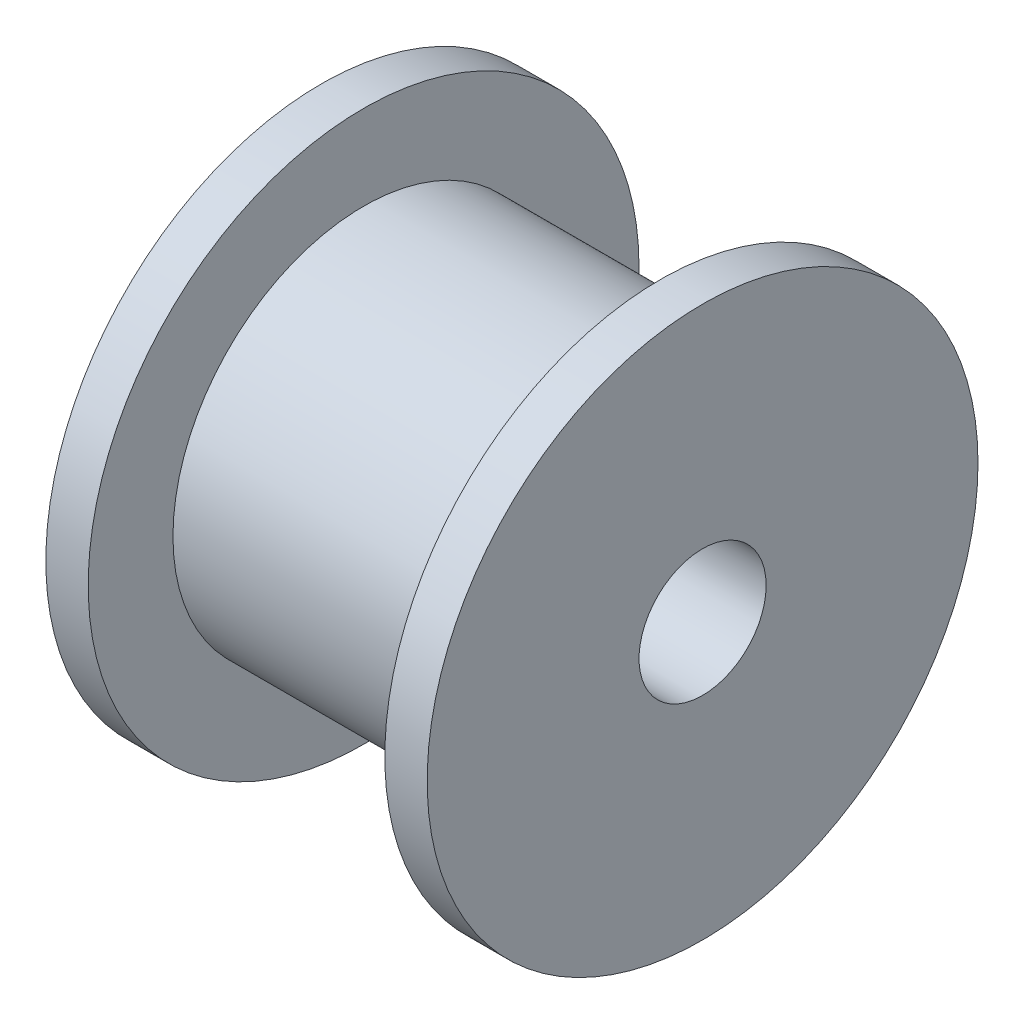
ISO-10303-21;
HEADER;
FILE_DESCRIPTION(('STEP AP214'),'2;1');
FILE_NAME('part.step','',(''),(''),'','','');
FILE_SCHEMA(('AUTOMOTIVE_DESIGN { 1 0 10303 214 1 1 1 1 }'));
ENDSEC;
DATA;
#1=APPLICATION_CONTEXT('core data for automotive mechanical design processes');
#2=APPLICATION_PROTOCOL_DEFINITION('international standard','automotive_design',2000,#1);
#3=PRODUCT_CONTEXT('',#1,'mechanical');
#4=PRODUCT('Part','Part','',(#3));
#5=PRODUCT_RELATED_PRODUCT_CATEGORY('part','',(#4));
#6=PRODUCT_DEFINITION_FORMATION('','',#4);
#7=PRODUCT_DEFINITION_CONTEXT('part definition',#1,'design');
#8=PRODUCT_DEFINITION('design','',#6,#7);
#9=PRODUCT_DEFINITION_SHAPE('','',#8);
#10=(LENGTH_UNIT() NAMED_UNIT(*) SI_UNIT(.MILLI.,.METRE.));
#11=(NAMED_UNIT(*) PLANE_ANGLE_UNIT() SI_UNIT($,.RADIAN.));
#12=(NAMED_UNIT(*) SI_UNIT($,.STERADIAN.) SOLID_ANGLE_UNIT());
#13=UNCERTAINTY_MEASURE_WITH_UNIT(LENGTH_MEASURE(1.E-05),#10,'distance_accuracy_value','');
#14=(GEOMETRIC_REPRESENTATION_CONTEXT(3) GLOBAL_UNCERTAINTY_ASSIGNED_CONTEXT((#13)) GLOBAL_UNIT_ASSIGNED_CONTEXT((#10,
#11,#12)) REPRESENTATION_CONTEXT('',''));
#15=CARTESIAN_POINT('',(0.,0.,0.));
#16=DIRECTION('',(0.,0.,1.));
#17=DIRECTION('',(1.,0.,0.));
#18=AXIS2_PLACEMENT_3D('',#15,#16,#17);
#19=CARTESIAN_POINT('',(-4.5,0.,0.));
#20=DIRECTION('',(1.,0.,0.));
#21=DIRECTION('',(0.,0.,-1.));
#22=AXIS2_PLACEMENT_3D('',#19,#20,#21);
#23=CYLINDRICAL_SURFACE('',#22,6.5);
#24=CARTESIAN_POINT('',(-4.5,0.,0.));
#25=DIRECTION('',(1.,0.,0.));
#26=DIRECTION('',(0.,0.,-1.));
#27=AXIS2_PLACEMENT_3D('',#24,#25,#26);
#28=CIRCLE('',#27,6.5);
#29=CARTESIAN_POINT('',(-4.5,0.,-6.5));
#30=VERTEX_POINT('',#29);
#31=EDGE_CURVE('E10',#30,#30,#28,.T.);
#32=ORIENTED_EDGE('',*,*,#31,.T.);
#33=EDGE_LOOP('',(#32));
#34=FACE_BOUND('',#33,.T.);
#35=CARTESIAN_POINT('',(-3.5,0.,0.));
#36=DIRECTION('',(1.,0.,0.));
#37=DIRECTION('',(0.,0.,-1.));
#38=AXIS2_PLACEMENT_3D('',#35,#36,#37);
#39=CIRCLE('',#38,6.5);
#40=CARTESIAN_POINT('',(-3.5,0.,-6.5));
#41=VERTEX_POINT('',#40);
#42=EDGE_CURVE('E60',#41,#41,#39,.T.);
#43=ORIENTED_EDGE('',*,*,#42,.F.);
#44=EDGE_LOOP('',(#43));
#45=FACE_BOUND('',#44,.T.);
#46=ADVANCED_FACE('F34',(#34,#45),#23,.T.);
#47=CARTESIAN_POINT('',(-4.5,0.,0.));
#48=DIRECTION('',(1.,0.,0.));
#49=DIRECTION('',(0.,0.,-1.));
#50=AXIS2_PLACEMENT_3D('',#47,#48,#49);
#51=CYLINDRICAL_SURFACE('',#50,1.5);
#52=CARTESIAN_POINT('',(-4.5,0.,0.));
#53=DIRECTION('',(1.,0.,0.));
#54=DIRECTION('',(0.,0.,-1.));
#55=AXIS2_PLACEMENT_3D('',#52,#53,#54);
#56=CIRCLE('',#55,1.5);
#57=CARTESIAN_POINT('',(-4.5,0.,-1.5));
#58=VERTEX_POINT('',#57);
#59=EDGE_CURVE('E41',#58,#58,#56,.T.);
#60=ORIENTED_EDGE('',*,*,#59,.F.);
#61=EDGE_LOOP('',(#60));
#62=FACE_BOUND('',#61,.T.);
#63=CARTESIAN_POINT('',(4.5,0.,0.));
#64=DIRECTION('',(1.,0.,0.));
#65=DIRECTION('',(0.,0.,-1.));
#66=AXIS2_PLACEMENT_3D('',#63,#64,#65);
#67=CIRCLE('',#66,1.5);
#68=CARTESIAN_POINT('',(4.5,0.,-1.5));
#69=VERTEX_POINT('',#68);
#70=EDGE_CURVE('E49',#69,#69,#67,.T.);
#71=ORIENTED_EDGE('',*,*,#70,.T.);
#72=EDGE_LOOP('',(#71));
#73=FACE_BOUND('',#72,.T.);
#74=ADVANCED_FACE('F36',(#62,#73),#51,.F.);
#75=CARTESIAN_POINT('',(3.5,0.,0.));
#76=DIRECTION('',(1.,0.,0.));
#77=DIRECTION('',(0.,0.,-1.));
#78=AXIS2_PLACEMENT_3D('',#75,#76,#77);
#79=CIRCLE('',#78,6.5);
#80=CARTESIAN_POINT('',(3.5,0.,-6.5));
#81=VERTEX_POINT('',#80);
#82=EDGE_CURVE('E54',#81,#81,#79,.T.);
#83=ORIENTED_EDGE('',*,*,#82,.T.);
#84=EDGE_LOOP('',(#83));
#85=FACE_BOUND('',#84,.T.);
#86=CARTESIAN_POINT('',(4.5,0.,0.));
#87=DIRECTION('',(1.,0.,0.));
#88=DIRECTION('',(0.,0.,-1.));
#89=AXIS2_PLACEMENT_3D('',#86,#87,#88);
#90=CIRCLE('',#89,6.5);
#91=CARTESIAN_POINT('',(4.5,0.,-6.5));
#92=VERTEX_POINT('',#91);
#93=EDGE_CURVE('E45',#92,#92,#90,.T.);
#94=ORIENTED_EDGE('',*,*,#93,.F.);
#95=EDGE_LOOP('',(#94));
#96=FACE_BOUND('',#95,.T.);
#97=ADVANCED_FACE('F77',(#85,#96),#23,.T.);
#98=CARTESIAN_POINT('',(-4.5,0.,0.));
#99=DIRECTION('',(1.,0.,0.));
#100=DIRECTION('',(0.,0.,-1.));
#101=AXIS2_PLACEMENT_3D('',#98,#99,#100);
#102=PLANE('',#101);
#103=ORIENTED_EDGE('',*,*,#59,.T.);
#104=EDGE_LOOP('',(#103));
#105=FACE_BOUND('',#104,.T.);
#106=ORIENTED_EDGE('',*,*,#31,.F.);
#107=EDGE_LOOP('',(#106));
#108=FACE_BOUND('',#107,.T.);
#109=ADVANCED_FACE('F84',(#105,#108),#102,.F.);
#110=CARTESIAN_POINT('',(4.5,0.,0.));
#111=DIRECTION('',(1.,0.,0.));
#112=DIRECTION('',(0.,0.,-1.));
#113=AXIS2_PLACEMENT_3D('',#110,#111,#112);
#114=PLANE('',#113);
#115=ORIENTED_EDGE('',*,*,#70,.F.);
#116=EDGE_LOOP('',(#115));
#117=FACE_BOUND('',#116,.T.);
#118=ORIENTED_EDGE('',*,*,#93,.T.);
#119=EDGE_LOOP('',(#118));
#120=FACE_BOUND('',#119,.T.);
#121=ADVANCED_FACE('F89',(#117,#120),#114,.T.);
#122=CARTESIAN_POINT('',(3.5,0.,0.));
#123=DIRECTION('',(-1.,0.,0.));
#124=DIRECTION('',(0.,0.,1.));
#125=AXIS2_PLACEMENT_3D('',#122,#123,#124);
#126=CYLINDRICAL_SURFACE('',#125,4.5);
#127=CARTESIAN_POINT('',(3.5,0.,0.));
#128=DIRECTION('',(1.,0.,0.));
#129=DIRECTION('',(0.,0.,-1.));
#130=AXIS2_PLACEMENT_3D('',#127,#128,#129);
#131=CIRCLE('',#130,4.5);
#132=CARTESIAN_POINT('',(3.5,0.,-4.5));
#133=VERTEX_POINT('',#132);
#134=EDGE_CURVE('E57',#133,#133,#131,.T.);
#135=ORIENTED_EDGE('',*,*,#134,.F.);
#136=EDGE_LOOP('',(#135));
#137=FACE_BOUND('',#136,.T.);
#138=CARTESIAN_POINT('',(-3.5,0.,0.));
#139=DIRECTION('',(1.,0.,0.));
#140=DIRECTION('',(0.,0.,-1.));
#141=AXIS2_PLACEMENT_3D('',#138,#139,#140);
#142=CIRCLE('',#141,4.5);
#143=CARTESIAN_POINT('',(-3.5,0.,-4.5));
#144=VERTEX_POINT('',#143);
#145=EDGE_CURVE('E63',#144,#144,#142,.T.);
#146=ORIENTED_EDGE('',*,*,#145,.T.);
#147=EDGE_LOOP('',(#146));
#148=FACE_BOUND('',#147,.T.);
#149=ADVANCED_FACE('F67',(#137,#148),#126,.T.);
#150=CARTESIAN_POINT('',(3.5,0.,0.));
#151=DIRECTION('',(1.,0.,0.));
#152=DIRECTION('',(0.,0.,-1.));
#153=AXIS2_PLACEMENT_3D('',#150,#151,#152);
#154=PLANE('',#153);
#155=ORIENTED_EDGE('',*,*,#134,.T.);
#156=EDGE_LOOP('',(#155));
#157=FACE_BOUND('',#156,.T.);
#158=ORIENTED_EDGE('',*,*,#82,.F.);
#159=EDGE_LOOP('',(#158));
#160=FACE_BOUND('',#159,.T.);
#161=ADVANCED_FACE('F72',(#157,#160),#154,.F.);
#162=CARTESIAN_POINT('',(-3.5,0.,0.));
#163=DIRECTION('',(1.,0.,0.));
#164=DIRECTION('',(0.,0.,-1.));
#165=AXIS2_PLACEMENT_3D('',#162,#163,#164);
#166=PLANE('',#165);
#167=ORIENTED_EDGE('',*,*,#145,.F.);
#168=EDGE_LOOP('',(#167));
#169=FACE_BOUND('',#168,.T.);
#170=ORIENTED_EDGE('',*,*,#42,.T.);
#171=EDGE_LOOP('',(#170));
#172=FACE_BOUND('',#171,.T.);
#173=ADVANCED_FACE('F69',(#169,#172),#166,.T.);
#174=CLOSED_SHELL('',(#46,#74,#97,#109,#121,#149,#161,#173));
#175=MANIFOLD_SOLID_BREP('B2',#174);
#176=ADVANCED_BREP_SHAPE_REPRESENTATION('',(#18,#175),#14);
#177=SHAPE_DEFINITION_REPRESENTATION(#9,#176);
ENDSEC;
END-ISO-10303-21;
